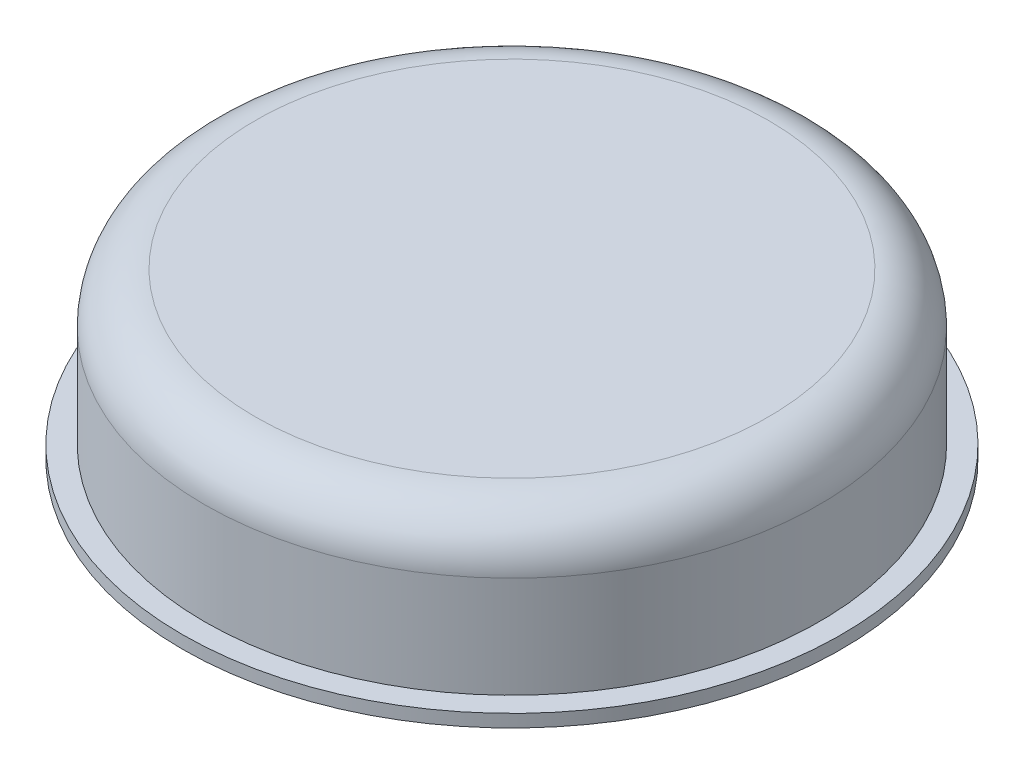
ISO-10303-21;
HEADER;
FILE_DESCRIPTION(('STEP AP214'),'2;1');
FILE_NAME('part.step','',(''),(''),'','','');
FILE_SCHEMA(('AUTOMOTIVE_DESIGN { 1 0 10303 214 1 1 1 1 }'));
ENDSEC;
DATA;
#1=APPLICATION_CONTEXT('core data for automotive mechanical design processes');
#2=APPLICATION_PROTOCOL_DEFINITION('international standard','automotive_design',2000,#1);
#3=PRODUCT_CONTEXT('',#1,'mechanical');
#4=PRODUCT('Part','Part','',(#3));
#5=PRODUCT_RELATED_PRODUCT_CATEGORY('part','',(#4));
#6=PRODUCT_DEFINITION_FORMATION('','',#4);
#7=PRODUCT_DEFINITION_CONTEXT('part definition',#1,'design');
#8=PRODUCT_DEFINITION('design','',#6,#7);
#9=PRODUCT_DEFINITION_SHAPE('','',#8);
#10=(LENGTH_UNIT() NAMED_UNIT(*) SI_UNIT(.MILLI.,.METRE.));
#11=(NAMED_UNIT(*) PLANE_ANGLE_UNIT() SI_UNIT($,.RADIAN.));
#12=(NAMED_UNIT(*) SI_UNIT($,.STERADIAN.) SOLID_ANGLE_UNIT());
#13=UNCERTAINTY_MEASURE_WITH_UNIT(LENGTH_MEASURE(1.E-05),#10,'distance_accuracy_value','');
#14=(GEOMETRIC_REPRESENTATION_CONTEXT(3) GLOBAL_UNCERTAINTY_ASSIGNED_CONTEXT((#13)) GLOBAL_UNIT_ASSIGNED_CONTEXT((#10,
#11,#12)) REPRESENTATION_CONTEXT('',''));
#15=CARTESIAN_POINT('',(0.,0.,0.));
#16=DIRECTION('',(0.,0.,1.));
#17=DIRECTION('',(1.,0.,0.));
#18=AXIS2_PLACEMENT_3D('',#15,#16,#17);
#19=CARTESIAN_POINT('',(0.,1.,0.));
#20=DIRECTION('',(0.,-1.,0.));
#21=DIRECTION('',(0.,0.,-1.));
#22=AXIS2_PLACEMENT_3D('',#19,#20,#21);
#23=CYLINDRICAL_SURFACE('',#22,26.);
#24=CARTESIAN_POINT('',(0.,1.,0.));
#25=DIRECTION('',(0.,1.,0.));
#26=DIRECTION('',(0.,0.,1.));
#27=AXIS2_PLACEMENT_3D('',#24,#25,#26);
#28=CIRCLE('',#27,26.);
#29=CARTESIAN_POINT('',(0.,1.,26.));
#30=VERTEX_POINT('',#29);
#31=EDGE_CURVE('E46',#30,#30,#28,.T.);
#32=ORIENTED_EDGE('',*,*,#31,.F.);
#33=EDGE_LOOP('',(#32));
#34=FACE_BOUND('',#33,.T.);
#35=CARTESIAN_POINT('',(0.,0.,0.));
#36=DIRECTION('',(0.,1.,0.));
#37=DIRECTION('',(0.,0.,1.));
#38=AXIS2_PLACEMENT_3D('',#35,#36,#37);
#39=CIRCLE('',#38,26.);
#40=CARTESIAN_POINT('',(0.,0.,26.));
#41=VERTEX_POINT('',#40);
#42=EDGE_CURVE('E49',#41,#41,#39,.T.);
#43=ORIENTED_EDGE('',*,*,#42,.T.);
#44=EDGE_LOOP('',(#43));
#45=FACE_BOUND('',#44,.T.);
#46=ADVANCED_FACE('F31',(#34,#45),#23,.T.);
#47=CARTESIAN_POINT('',(0.,1.,0.));
#48=DIRECTION('',(0.,1.,0.));
#49=DIRECTION('',(0.,0.,1.));
#50=AXIS2_PLACEMENT_3D('',#47,#48,#49);
#51=PLANE('',#50);
#52=CARTESIAN_POINT('',(0.,1.,0.));
#53=DIRECTION('',(0.,1.,0.));
#54=DIRECTION('',(0.,0.,1.));
#55=AXIS2_PLACEMENT_3D('',#52,#53,#54);
#56=CIRCLE('',#55,24.25);
#57=CARTESIAN_POINT('',(0.,1.,24.25));
#58=VERTEX_POINT('',#57);
#59=EDGE_CURVE('E42',#58,#58,#56,.T.);
#60=ORIENTED_EDGE('',*,*,#59,.F.);
#61=EDGE_LOOP('',(#60));
#62=FACE_BOUND('',#61,.T.);
#63=ORIENTED_EDGE('',*,*,#31,.T.);
#64=EDGE_LOOP('',(#63));
#65=FACE_BOUND('',#64,.T.);
#66=ADVANCED_FACE('F55',(#62,#65),#51,.T.);
#67=CARTESIAN_POINT('',(0.,0.,0.));
#68=DIRECTION('',(0.,1.,0.));
#69=DIRECTION('',(0.,0.,1.));
#70=AXIS2_PLACEMENT_3D('',#67,#68,#69);
#71=PLANE('',#70);
#72=ORIENTED_EDGE('',*,*,#42,.F.);
#73=EDGE_LOOP('',(#72));
#74=FACE_BOUND('',#73,.T.);
#75=ADVANCED_FACE('F61',(#74),#71,.F.);
#76=CARTESIAN_POINT('',(0.,13.,0.));
#77=DIRECTION('',(0.,-1.,0.));
#78=DIRECTION('',(0.,0.,-1.));
#79=AXIS2_PLACEMENT_3D('',#76,#77,#78);
#80=CYLINDRICAL_SURFACE('',#79,24.25);
#81=CARTESIAN_POINT('',(0.,9.,0.));
#82=DIRECTION('',(0.,1.,0.));
#83=DIRECTION('',(0.,0.,1.));
#84=AXIS2_PLACEMENT_3D('',#81,#82,#83);
#85=CIRCLE('',#84,24.25);
#86=CARTESIAN_POINT('',(0.,9.,24.25));
#87=VERTEX_POINT('',#86);
#88=EDGE_CURVE('E10',#87,#87,#85,.F.);
#89=ORIENTED_EDGE('',*,*,#88,.T.);
#90=EDGE_LOOP('',(#89));
#91=FACE_BOUND('',#90,.T.);
#92=ORIENTED_EDGE('',*,*,#59,.T.);
#93=EDGE_LOOP('',(#92));
#94=FACE_BOUND('',#93,.T.);
#95=ADVANCED_FACE('F63',(#91,#94),#80,.T.);
#96=CARTESIAN_POINT('',(0.,13.,0.));
#97=DIRECTION('',(0.,1.,0.));
#98=DIRECTION('',(0.,0.,1.));
#99=AXIS2_PLACEMENT_3D('',#96,#97,#98);
#100=PLANE('',#99);
#101=CARTESIAN_POINT('',(0.,13.,0.));
#102=DIRECTION('',(0.,1.,0.));
#103=DIRECTION('',(0.,0.,1.));
#104=AXIS2_PLACEMENT_3D('',#101,#102,#103);
#105=CIRCLE('',#104,20.25);
#106=CARTESIAN_POINT('',(0.,13.,20.25));
#107=VERTEX_POINT('',#106);
#108=EDGE_CURVE('E38',#107,#107,#105,.T.);
#109=ORIENTED_EDGE('',*,*,#108,.T.);
#110=EDGE_LOOP('',(#109));
#111=FACE_BOUND('',#110,.T.);
#112=ADVANCED_FACE('F69',(#111),#100,.T.);
#113=CARTESIAN_POINT('',(0.,9.,0.));
#114=DIRECTION('',(0.,1.,0.));
#115=DIRECTION('',(0.,0.,1.));
#116=AXIS2_PLACEMENT_3D('',#113,#114,#115);
#117=TOROIDAL_SURFACE('',#116,20.25,4.);
#118=ORIENTED_EDGE('',*,*,#88,.F.);
#119=EDGE_LOOP('',(#118));
#120=FACE_BOUND('',#119,.T.);
#121=ORIENTED_EDGE('',*,*,#108,.F.);
#122=EDGE_LOOP('',(#121));
#123=FACE_BOUND('',#122,.T.);
#124=ADVANCED_FACE('F33',(#120,#123),#117,.T.);
#125=CLOSED_SHELL('',(#46,#66,#75,#95,#112,#124));
#126=MANIFOLD_SOLID_BREP('B2',#125);
#127=ADVANCED_BREP_SHAPE_REPRESENTATION('',(#18,#126),#14);
#128=SHAPE_DEFINITION_REPRESENTATION(#9,#127);
ENDSEC;
END-ISO-10303-21;
